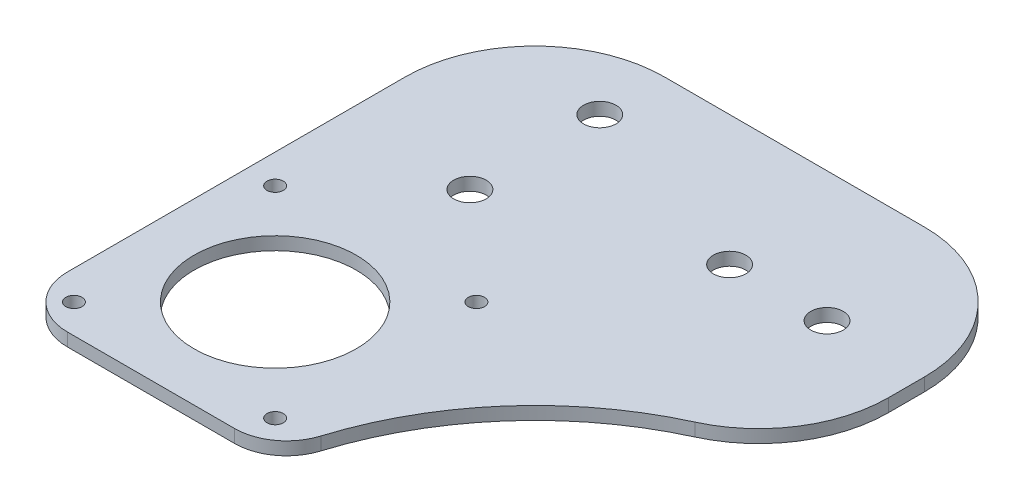
ISO-10303-21;
HEADER;
FILE_DESCRIPTION(('STEP AP214'),'2;1');
FILE_NAME('part.step','',(''),(''),'','','');
FILE_SCHEMA(('AUTOMOTIVE_DESIGN { 1 0 10303 214 1 1 1 1 }'));
ENDSEC;
DATA;
#1=APPLICATION_CONTEXT('core data for automotive mechanical design processes');
#2=APPLICATION_PROTOCOL_DEFINITION('international standard','automotive_design',2000,#1);
#3=PRODUCT_CONTEXT('',#1,'mechanical');
#4=PRODUCT('Part','Part','',(#3));
#5=PRODUCT_RELATED_PRODUCT_CATEGORY('part','',(#4));
#6=PRODUCT_DEFINITION_FORMATION('','',#4);
#7=PRODUCT_DEFINITION_CONTEXT('part definition',#1,'design');
#8=PRODUCT_DEFINITION('design','',#6,#7);
#9=PRODUCT_DEFINITION_SHAPE('','',#8);
#10=(LENGTH_UNIT() NAMED_UNIT(*) SI_UNIT(.MILLI.,.METRE.));
#11=(NAMED_UNIT(*) PLANE_ANGLE_UNIT() SI_UNIT($,.RADIAN.));
#12=(NAMED_UNIT(*) SI_UNIT($,.STERADIAN.) SOLID_ANGLE_UNIT());
#13=UNCERTAINTY_MEASURE_WITH_UNIT(LENGTH_MEASURE(1.E-05),#10,'distance_accuracy_value','');
#14=(GEOMETRIC_REPRESENTATION_CONTEXT(3) GLOBAL_UNCERTAINTY_ASSIGNED_CONTEXT((#13)) GLOBAL_UNIT_ASSIGNED_CONTEXT((#10,
#11,#12)) REPRESENTATION_CONTEXT('',''));
#15=CARTESIAN_POINT('',(0.,0.,0.));
#16=DIRECTION('',(0.,0.,1.));
#17=DIRECTION('',(1.,0.,0.));
#18=AXIS2_PLACEMENT_3D('',#15,#16,#17);
#19=CARTESIAN_POINT('',(0.,2.,-40.));
#20=DIRECTION('',(0.,0.,1.));
#21=DIRECTION('',(1.,0.,0.));
#22=AXIS2_PLACEMENT_3D('',#19,#20,#21);
#23=PLANE('',#22);
#24=DIRECTION('',(-1.,0.,0.));
#25=VECTOR('',#24,1.);
#26=CARTESIAN_POINT('',(0.,2.,-40.));
#27=LINE('',#26,#25);
#28=CARTESIAN_POINT('',(60.,2.,-40.));
#29=VERTEX_POINT('',#28);
#30=CARTESIAN_POINT('',(20.,2.,-40.));
#31=VERTEX_POINT('',#30);
#32=EDGE_CURVE('E134',#29,#31,#27,.T.);
#33=ORIENTED_EDGE('',*,*,#32,.F.);
#34=DIRECTION('',(0.,-1.,0.));
#35=VECTOR('',#34,1.);
#36=CARTESIAN_POINT('',(60.,0.,-40.));
#37=LINE('',#36,#35);
#38=CARTESIAN_POINT('',(60.,0.,-40.));
#39=VERTEX_POINT('',#38);
#40=EDGE_CURVE('E119',#29,#39,#37,.T.);
#41=ORIENTED_EDGE('',*,*,#40,.T.);
#42=DIRECTION('',(-1.,0.,0.));
#43=VECTOR('',#42,1.);
#44=CARTESIAN_POINT('',(0.,0.,-40.));
#45=LINE('',#44,#43);
#46=CARTESIAN_POINT('',(20.,0.,-40.));
#47=VERTEX_POINT('',#46);
#48=EDGE_CURVE('E131',#39,#47,#45,.T.);
#49=ORIENTED_EDGE('',*,*,#48,.T.);
#50=DIRECTION('',(0.,-1.,0.));
#51=VECTOR('',#50,1.);
#52=CARTESIAN_POINT('',(20.,2.,-40.));
#53=LINE('',#52,#51);
#54=EDGE_CURVE('E136',#47,#31,#53,.F.);
#55=ORIENTED_EDGE('',*,*,#54,.T.);
#56=EDGE_LOOP('',(#33,#41,#49,#55));
#57=FACE_BOUND('',#56,.T.);
#58=ADVANCED_FACE('F35',(#57),#23,.F.);
#59=CARTESIAN_POINT('',(0.,2.,0.));
#60=DIRECTION('',(1.,0.,0.));
#61=DIRECTION('',(0.,0.,-1.));
#62=AXIS2_PLACEMENT_3D('',#59,#60,#61);
#63=PLANE('',#62);
#64=DIRECTION('',(0.,0.,1.));
#65=VECTOR('',#64,1.);
#66=CARTESIAN_POINT('',(0.,0.,0.));
#67=LINE('',#66,#65);
#68=CARTESIAN_POINT('',(0.,0.,-20.));
#69=VERTEX_POINT('',#68);
#70=CARTESIAN_POINT('',(0.,0.,32.));
#71=VERTEX_POINT('',#70);
#72=EDGE_CURVE('E142',#69,#71,#67,.T.);
#73=ORIENTED_EDGE('',*,*,#72,.T.);
#74=DIRECTION('',(0.,-1.,0.));
#75=VECTOR('',#74,1.);
#76=CARTESIAN_POINT('',(0.,2.,32.));
#77=LINE('',#76,#75);
#78=CARTESIAN_POINT('',(0.,2.,32.));
#79=VERTEX_POINT('',#78);
#80=EDGE_CURVE('E58',#71,#79,#77,.F.);
#81=ORIENTED_EDGE('',*,*,#80,.T.);
#82=DIRECTION('',(0.,0.,1.));
#83=VECTOR('',#82,1.);
#84=CARTESIAN_POINT('',(0.,2.,0.));
#85=LINE('',#84,#83);
#86=CARTESIAN_POINT('',(0.,2.,-20.));
#87=VERTEX_POINT('',#86);
#88=EDGE_CURVE('E211',#87,#79,#85,.T.);
#89=ORIENTED_EDGE('',*,*,#88,.F.);
#90=DIRECTION('',(0.,-1.,0.));
#91=VECTOR('',#90,1.);
#92=CARTESIAN_POINT('',(0.,2.,-20.));
#93=LINE('',#92,#91);
#94=EDGE_CURVE('E193',#87,#69,#93,.T.);
#95=ORIENTED_EDGE('',*,*,#94,.T.);
#96=EDGE_LOOP('',(#73,#81,#89,#95));
#97=FACE_BOUND('',#96,.T.);
#98=ADVANCED_FACE('F220',(#97),#63,.F.);
#99=CARTESIAN_POINT('',(0.,2.,40.));
#100=DIRECTION('',(0.,0.,-1.));
#101=DIRECTION('',(-1.,0.,0.));
#102=AXIS2_PLACEMENT_3D('',#99,#100,#101);
#103=PLANE('',#102);
#104=DIRECTION('',(1.,0.,0.));
#105=VECTOR('',#104,1.);
#106=CARTESIAN_POINT('',(0.,2.,40.));
#107=LINE('',#106,#105);
#108=CARTESIAN_POINT('',(8.,2.,40.));
#109=VERTEX_POINT('',#108);
#110=CARTESIAN_POINT('',(33.7497576478441,2.,40.));
#111=VERTEX_POINT('',#110);
#112=EDGE_CURVE('E210',#109,#111,#107,.T.);
#113=ORIENTED_EDGE('',*,*,#112,.F.);
#114=DIRECTION('',(0.,-1.,0.));
#115=VECTOR('',#114,1.);
#116=CARTESIAN_POINT('',(8.,2.,40.));
#117=LINE('',#116,#115);
#118=CARTESIAN_POINT('',(8.,0.,40.));
#119=VERTEX_POINT('',#118);
#120=EDGE_CURVE('E198',#109,#119,#117,.T.);
#121=ORIENTED_EDGE('',*,*,#120,.T.);
#122=DIRECTION('',(1.,0.,0.));
#123=VECTOR('',#122,1.);
#124=CARTESIAN_POINT('',(0.,0.,40.));
#125=LINE('',#124,#123);
#126=CARTESIAN_POINT('',(33.7497576478441,0.,40.));
#127=VERTEX_POINT('',#126);
#128=EDGE_CURVE('E145',#119,#127,#125,.T.);
#129=ORIENTED_EDGE('',*,*,#128,.T.);
#130=DIRECTION('',(0.,1.,0.));
#131=VECTOR('',#130,1.);
#132=CARTESIAN_POINT('',(33.7497576478441,2.,40.));
#133=LINE('',#132,#131);
#134=EDGE_CURVE('E196',#127,#111,#133,.T.);
#135=ORIENTED_EDGE('',*,*,#134,.T.);
#136=EDGE_LOOP('',(#113,#121,#129,#135));
#137=FACE_BOUND('',#136,.T.);
#138=ADVANCED_FACE('F215',(#137),#103,.F.);
#139=CARTESIAN_POINT('',(35.5,2.,4.49999999999998));
#140=DIRECTION('',(0.,-1.,0.));
#141=DIRECTION('',(0.,0.,-1.));
#142=AXIS2_PLACEMENT_3D('',#139,#140,#141);
#143=CYLINDRICAL_SURFACE('',#142,1.25);
#144=CARTESIAN_POINT('',(35.5,2.,4.49999999999998));
#145=DIRECTION('',(0.,1.,0.));
#146=DIRECTION('',(0.,0.,1.));
#147=AXIS2_PLACEMENT_3D('',#144,#145,#146);
#148=CIRCLE('',#147,1.25);
#149=CARTESIAN_POINT('',(35.5,2.,5.74999999999998));
#150=VERTEX_POINT('',#149);
#151=EDGE_CURVE('E245',#150,#150,#148,.T.);
#152=ORIENTED_EDGE('',*,*,#151,.T.);
#153=EDGE_LOOP('',(#152));
#154=FACE_BOUND('',#153,.T.);
#155=CARTESIAN_POINT('',(35.5,0.,4.49999999999998));
#156=DIRECTION('',(0.,1.,0.));
#157=DIRECTION('',(0.,0.,1.));
#158=AXIS2_PLACEMENT_3D('',#155,#156,#157);
#159=CIRCLE('',#158,1.25);
#160=CARTESIAN_POINT('',(35.5,0.,5.74999999999998));
#161=VERTEX_POINT('',#160);
#162=EDGE_CURVE('E165',#161,#161,#159,.T.);
#163=ORIENTED_EDGE('',*,*,#162,.F.);
#164=EDGE_LOOP('',(#163));
#165=FACE_BOUND('',#164,.T.);
#166=ADVANCED_FACE('F288',(#154,#165),#143,.F.);
#167=CARTESIAN_POINT('',(35.5,2.,35.5));
#168=DIRECTION('',(0.,-1.,0.));
#169=DIRECTION('',(0.,0.,-1.));
#170=AXIS2_PLACEMENT_3D('',#167,#168,#169);
#171=CYLINDRICAL_SURFACE('',#170,1.25);
#172=CARTESIAN_POINT('',(35.5,2.,35.5));
#173=DIRECTION('',(0.,1.,0.));
#174=DIRECTION('',(0.,0.,1.));
#175=AXIS2_PLACEMENT_3D('',#172,#173,#174);
#176=CIRCLE('',#175,1.25);
#177=CARTESIAN_POINT('',(35.5,2.,36.75));
#178=VERTEX_POINT('',#177);
#179=EDGE_CURVE('E242',#178,#178,#176,.T.);
#180=ORIENTED_EDGE('',*,*,#179,.T.);
#181=EDGE_LOOP('',(#180));
#182=FACE_BOUND('',#181,.T.);
#183=CARTESIAN_POINT('',(35.5,0.,35.5));
#184=DIRECTION('',(0.,1.,0.));
#185=DIRECTION('',(0.,0.,1.));
#186=AXIS2_PLACEMENT_3D('',#183,#184,#185);
#187=CIRCLE('',#186,1.25);
#188=CARTESIAN_POINT('',(35.5,0.,36.75));
#189=VERTEX_POINT('',#188);
#190=EDGE_CURVE('E162',#189,#189,#187,.T.);
#191=ORIENTED_EDGE('',*,*,#190,.F.);
#192=EDGE_LOOP('',(#191));
#193=FACE_BOUND('',#192,.T.);
#194=ADVANCED_FACE('F298',(#182,#193),#171,.F.);
#195=CARTESIAN_POINT('',(4.50000000000001,2.,35.5));
#196=DIRECTION('',(0.,-1.,0.));
#197=DIRECTION('',(0.,0.,-1.));
#198=AXIS2_PLACEMENT_3D('',#195,#196,#197);
#199=CYLINDRICAL_SURFACE('',#198,1.25);
#200=CARTESIAN_POINT('',(4.50000000000001,2.,35.5));
#201=DIRECTION('',(0.,1.,0.));
#202=DIRECTION('',(0.,0.,1.));
#203=AXIS2_PLACEMENT_3D('',#200,#201,#202);
#204=CIRCLE('',#203,1.25);
#205=CARTESIAN_POINT('',(4.50000000000001,2.,36.75));
#206=VERTEX_POINT('',#205);
#207=EDGE_CURVE('E239',#206,#206,#204,.T.);
#208=ORIENTED_EDGE('',*,*,#207,.T.);
#209=EDGE_LOOP('',(#208));
#210=FACE_BOUND('',#209,.T.);
#211=CARTESIAN_POINT('',(4.50000000000001,0.,35.5));
#212=DIRECTION('',(0.,1.,0.));
#213=DIRECTION('',(0.,0.,1.));
#214=AXIS2_PLACEMENT_3D('',#211,#212,#213);
#215=CIRCLE('',#214,1.25);
#216=CARTESIAN_POINT('',(4.50000000000001,0.,36.75));
#217=VERTEX_POINT('',#216);
#218=EDGE_CURVE('E159',#217,#217,#215,.T.);
#219=ORIENTED_EDGE('',*,*,#218,.F.);
#220=EDGE_LOOP('',(#219));
#221=FACE_BOUND('',#220,.T.);
#222=ADVANCED_FACE('F294',(#210,#221),#199,.F.);
#223=CARTESIAN_POINT('',(20.,2.,20.));
#224=DIRECTION('',(0.,-1.,0.));
#225=DIRECTION('',(0.,0.,-1.));
#226=AXIS2_PLACEMENT_3D('',#223,#224,#225);
#227=CYLINDRICAL_SURFACE('',#226,12.5);
#228=CARTESIAN_POINT('',(20.,2.,20.));
#229=DIRECTION('',(0.,1.,0.));
#230=DIRECTION('',(0.,0.,1.));
#231=AXIS2_PLACEMENT_3D('',#228,#229,#230);
#232=CIRCLE('',#231,12.5);
#233=CARTESIAN_POINT('',(20.,2.,32.5));
#234=VERTEX_POINT('',#233);
#235=EDGE_CURVE('E236',#234,#234,#232,.T.);
#236=ORIENTED_EDGE('',*,*,#235,.T.);
#237=EDGE_LOOP('',(#236));
#238=FACE_BOUND('',#237,.T.);
#239=CARTESIAN_POINT('',(20.,0.,20.));
#240=DIRECTION('',(0.,1.,0.));
#241=DIRECTION('',(0.,0.,1.));
#242=AXIS2_PLACEMENT_3D('',#239,#240,#241);
#243=CIRCLE('',#242,12.5);
#244=CARTESIAN_POINT('',(20.,0.,32.5));
#245=VERTEX_POINT('',#244);
#246=EDGE_CURVE('E156',#245,#245,#243,.T.);
#247=ORIENTED_EDGE('',*,*,#246,.F.);
#248=EDGE_LOOP('',(#247));
#249=FACE_BOUND('',#248,.T.);
#250=ADVANCED_FACE('F290',(#238,#249),#227,.F.);
#251=CARTESIAN_POINT('',(80.,2.,0.));
#252=DIRECTION('',(1.,0.,0.));
#253=DIRECTION('',(0.,0.,-1.));
#254=AXIS2_PLACEMENT_3D('',#251,#252,#253);
#255=PLANE('',#254);
#256=DIRECTION('',(0.,0.,1.));
#257=VECTOR('',#256,1.);
#258=CARTESIAN_POINT('',(80.,0.,0.));
#259=LINE('',#258,#257);
#260=CARTESIAN_POINT('',(80.,0.,-20.));
#261=VERTEX_POINT('',#260);
#262=CARTESIAN_POINT('',(80.,0.,-14.4848508325628));
#263=VERTEX_POINT('',#262);
#264=EDGE_CURVE('E154',#261,#263,#259,.T.);
#265=ORIENTED_EDGE('',*,*,#264,.F.);
#266=DIRECTION('',(0.,-1.,0.));
#267=VECTOR('',#266,1.);
#268=CARTESIAN_POINT('',(80.,2.,-20.));
#269=LINE('',#268,#267);
#270=CARTESIAN_POINT('',(80.,2.,-20.));
#271=VERTEX_POINT('',#270);
#272=EDGE_CURVE('E120',#261,#271,#269,.F.);
#273=ORIENTED_EDGE('',*,*,#272,.T.);
#274=DIRECTION('',(0.,0.,1.));
#275=VECTOR('',#274,1.);
#276=CARTESIAN_POINT('',(80.,2.,0.));
#277=LINE('',#276,#275);
#278=CARTESIAN_POINT('',(80.,2.,-14.4848508325628));
#279=VERTEX_POINT('',#278);
#280=EDGE_CURVE('E217',#271,#279,#277,.T.);
#281=ORIENTED_EDGE('',*,*,#280,.T.);
#282=DIRECTION('',(0.,-1.,0.));
#283=VECTOR('',#282,1.);
#284=CARTESIAN_POINT('',(80.,0.,-14.4848508325628));
#285=LINE('',#284,#283);
#286=EDGE_CURVE('E125',#279,#263,#285,.T.);
#287=ORIENTED_EDGE('',*,*,#286,.T.);
#288=EDGE_LOOP('',(#265,#273,#281,#287));
#289=FACE_BOUND('',#288,.T.);
#290=ADVANCED_FACE('F273',(#289),#255,.T.);
#291=CARTESIAN_POINT('',(20.,2.,-10.));
#292=DIRECTION('',(0.,-1.,0.));
#293=DIRECTION('',(0.,0.,-1.));
#294=AXIS2_PLACEMENT_3D('',#291,#292,#293);
#295=CYLINDRICAL_SURFACE('',#294,2.5);
#296=CARTESIAN_POINT('',(20.,2.,-10.));
#297=DIRECTION('',(0.,1.,0.));
#298=DIRECTION('',(0.,0.,1.));
#299=AXIS2_PLACEMENT_3D('',#296,#297,#298);
#300=CIRCLE('',#299,2.5);
#301=CARTESIAN_POINT('',(20.,2.,-7.5));
#302=VERTEX_POINT('',#301);
#303=EDGE_CURVE('E226',#302,#302,#300,.T.);
#304=ORIENTED_EDGE('',*,*,#303,.T.);
#305=EDGE_LOOP('',(#304));
#306=FACE_BOUND('',#305,.T.);
#307=CARTESIAN_POINT('',(20.,0.,-10.));
#308=DIRECTION('',(0.,1.,0.));
#309=DIRECTION('',(0.,0.,1.));
#310=AXIS2_PLACEMENT_3D('',#307,#308,#309);
#311=CIRCLE('',#310,2.5);
#312=CARTESIAN_POINT('',(20.,0.,-7.5));
#313=VERTEX_POINT('',#312);
#314=EDGE_CURVE('E143',#313,#313,#311,.T.);
#315=ORIENTED_EDGE('',*,*,#314,.F.);
#316=EDGE_LOOP('',(#315));
#317=FACE_BOUND('',#316,.T.);
#318=ADVANCED_FACE('F263',(#306,#317),#295,.F.);
#319=CARTESIAN_POINT('',(65.,2.,-20.));
#320=DIRECTION('',(0.,-1.,0.));
#321=DIRECTION('',(0.,0.,-1.));
#322=AXIS2_PLACEMENT_3D('',#319,#320,#321);
#323=CYLINDRICAL_SURFACE('',#322,2.5);
#324=CARTESIAN_POINT('',(65.,2.,-20.));
#325=DIRECTION('',(0.,1.,0.));
#326=DIRECTION('',(0.,0.,1.));
#327=AXIS2_PLACEMENT_3D('',#324,#325,#326);
#328=CIRCLE('',#327,2.5);
#329=CARTESIAN_POINT('',(65.,2.,-17.5));
#330=VERTEX_POINT('',#329);
#331=EDGE_CURVE('E230',#330,#330,#328,.T.);
#332=ORIENTED_EDGE('',*,*,#331,.T.);
#333=EDGE_LOOP('',(#332));
#334=FACE_BOUND('',#333,.T.);
#335=CARTESIAN_POINT('',(65.,0.,-20.));
#336=DIRECTION('',(0.,1.,0.));
#337=DIRECTION('',(0.,0.,1.));
#338=AXIS2_PLACEMENT_3D('',#335,#336,#337);
#339=CIRCLE('',#338,2.5);
#340=CARTESIAN_POINT('',(65.,0.,-17.5));
#341=VERTEX_POINT('',#340);
#342=EDGE_CURVE('E148',#341,#341,#339,.T.);
#343=ORIENTED_EDGE('',*,*,#342,.F.);
#344=EDGE_LOOP('',(#343));
#345=FACE_BOUND('',#344,.T.);
#346=ADVANCED_FACE('F260',(#334,#345),#323,.F.);
#347=CARTESIAN_POINT('',(50.,2.,-20.));
#348=DIRECTION('',(0.,-1.,0.));
#349=DIRECTION('',(0.,0.,-1.));
#350=AXIS2_PLACEMENT_3D('',#347,#348,#349);
#351=CYLINDRICAL_SURFACE('',#350,2.5);
#352=CARTESIAN_POINT('',(50.,2.,-20.));
#353=DIRECTION('',(0.,1.,0.));
#354=DIRECTION('',(0.,0.,1.));
#355=AXIS2_PLACEMENT_3D('',#352,#353,#354);
#356=CIRCLE('',#355,2.5);
#357=CARTESIAN_POINT('',(50.,2.,-17.5));
#358=VERTEX_POINT('',#357);
#359=EDGE_CURVE('E324',#358,#358,#356,.T.);
#360=ORIENTED_EDGE('',*,*,#359,.T.);
#361=EDGE_LOOP('',(#360));
#362=FACE_BOUND('',#361,.T.);
#363=CARTESIAN_POINT('',(50.,0.,-20.));
#364=DIRECTION('',(0.,1.,0.));
#365=DIRECTION('',(0.,0.,1.));
#366=AXIS2_PLACEMENT_3D('',#363,#364,#365);
#367=CIRCLE('',#366,2.5);
#368=CARTESIAN_POINT('',(50.,0.,-17.5));
#369=VERTEX_POINT('',#368);
#370=EDGE_CURVE('E253',#369,#369,#367,.T.);
#371=ORIENTED_EDGE('',*,*,#370,.F.);
#372=EDGE_LOOP('',(#371));
#373=FACE_BOUND('',#372,.T.);
#374=ADVANCED_FACE('F262',(#362,#373),#351,.F.);
#375=CARTESIAN_POINT('',(20.,2.,-30.));
#376=DIRECTION('',(0.,-1.,0.));
#377=DIRECTION('',(0.,0.,-1.));
#378=AXIS2_PLACEMENT_3D('',#375,#376,#377);
#379=CYLINDRICAL_SURFACE('',#378,2.5);
#380=CARTESIAN_POINT('',(20.,2.,-30.));
#381=DIRECTION('',(0.,1.,0.));
#382=DIRECTION('',(0.,0.,1.));
#383=AXIS2_PLACEMENT_3D('',#380,#381,#382);
#384=CIRCLE('',#383,2.5);
#385=CARTESIAN_POINT('',(20.,2.,-27.5));
#386=VERTEX_POINT('',#385);
#387=EDGE_CURVE('E171',#386,#386,#384,.T.);
#388=ORIENTED_EDGE('',*,*,#387,.T.);
#389=EDGE_LOOP('',(#388));
#390=FACE_BOUND('',#389,.T.);
#391=CARTESIAN_POINT('',(20.,0.,-30.));
#392=DIRECTION('',(0.,1.,0.));
#393=DIRECTION('',(0.,0.,1.));
#394=AXIS2_PLACEMENT_3D('',#391,#392,#393);
#395=CIRCLE('',#394,2.5);
#396=CARTESIAN_POINT('',(20.,0.,-27.5));
#397=VERTEX_POINT('',#396);
#398=EDGE_CURVE('E250',#397,#397,#395,.T.);
#399=ORIENTED_EDGE('',*,*,#398,.F.);
#400=EDGE_LOOP('',(#399));
#401=FACE_BOUND('',#400,.T.);
#402=ADVANCED_FACE('F270',(#390,#401),#379,.F.);
#403=CARTESIAN_POINT('',(4.50000000000001,2.,4.49999999999999));
#404=DIRECTION('',(0.,-1.,0.));
#405=DIRECTION('',(0.,0.,-1.));
#406=AXIS2_PLACEMENT_3D('',#403,#404,#405);
#407=CYLINDRICAL_SURFACE('',#406,1.25);
#408=CARTESIAN_POINT('',(4.50000000000001,2.,4.49999999999999));
#409=DIRECTION('',(0.,1.,0.));
#410=DIRECTION('',(0.,0.,1.));
#411=AXIS2_PLACEMENT_3D('',#408,#409,#410);
#412=CIRCLE('',#411,1.25);
#413=CARTESIAN_POINT('',(4.50000000000001,2.,5.74999999999999));
#414=VERTEX_POINT('',#413);
#415=EDGE_CURVE('E176',#414,#414,#412,.T.);
#416=ORIENTED_EDGE('',*,*,#415,.T.);
#417=EDGE_LOOP('',(#416));
#418=FACE_BOUND('',#417,.T.);
#419=CARTESIAN_POINT('',(4.50000000000001,0.,4.49999999999999));
#420=DIRECTION('',(0.,1.,0.));
#421=DIRECTION('',(0.,0.,1.));
#422=AXIS2_PLACEMENT_3D('',#419,#420,#421);
#423=CIRCLE('',#422,1.25);
#424=CARTESIAN_POINT('',(4.50000000000001,0.,5.74999999999999));
#425=VERTEX_POINT('',#424);
#426=EDGE_CURVE('E168',#425,#425,#423,.T.);
#427=ORIENTED_EDGE('',*,*,#426,.F.);
#428=EDGE_LOOP('',(#427));
#429=FACE_BOUND('',#428,.T.);
#430=ADVANCED_FACE('F306',(#418,#429),#407,.F.);
#431=CARTESIAN_POINT('',(0.,2.,0.));
#432=DIRECTION('',(0.,1.,0.));
#433=DIRECTION('',(0.,0.,1.));
#434=AXIS2_PLACEMENT_3D('',#431,#432,#433);
#435=PLANE('',#434);
#436=ORIENTED_EDGE('',*,*,#387,.F.);
#437=EDGE_LOOP('',(#436));
#438=FACE_BOUND('',#437,.T.);
#439=ORIENTED_EDGE('',*,*,#359,.F.);
#440=EDGE_LOOP('',(#439));
#441=FACE_BOUND('',#440,.T.);
#442=ORIENTED_EDGE('',*,*,#331,.F.);
#443=EDGE_LOOP('',(#442));
#444=FACE_BOUND('',#443,.T.);
#445=ORIENTED_EDGE('',*,*,#303,.F.);
#446=EDGE_LOOP('',(#445));
#447=FACE_BOUND('',#446,.T.);
#448=ORIENTED_EDGE('',*,*,#88,.T.);
#449=CARTESIAN_POINT('',(8.,2.,32.));
#450=DIRECTION('',(0.,1.,0.));
#451=DIRECTION('',(0.,0.,1.));
#452=AXIS2_PLACEMENT_3D('',#449,#450,#451);
#453=CIRCLE('',#452,8.);
#454=EDGE_CURVE('E43',#79,#109,#453,.T.);
#455=ORIENTED_EDGE('',*,*,#454,.T.);
#456=ORIENTED_EDGE('',*,*,#112,.T.);
#457=CARTESIAN_POINT('',(33.7497576478441,2.,32.));
#458=DIRECTION('',(0.,1.,0.));
#459=DIRECTION('',(0.,0.,1.));
#460=AXIS2_PLACEMENT_3D('',#457,#458,#459);
#461=CIRCLE('',#460,8.);
#462=CARTESIAN_POINT('',(41.3918268652762,2.,34.366173720583));
#463=VERTEX_POINT('',#462);
#464=EDGE_CURVE('E50',#111,#463,#461,.T.);
#465=ORIENTED_EDGE('',*,*,#464,.T.);
#466=CARTESIAN_POINT('',(89.1547594742265,2.,49.1547594742265));
#467=DIRECTION('',(0.,1.,0.));
#468=DIRECTION('',(0.,0.,1.));
#469=AXIS2_PLACEMENT_3D('',#466,#467,#468);
#470=CIRCLE('',#469,50.);
#471=CARTESIAN_POINT('',(68.3299312783504,2.,3.69789496937702));
#472=VERTEX_POINT('',#471);
#473=EDGE_CURVE('E175',#463,#472,#470,.F.);
#474=ORIENTED_EDGE('',*,*,#473,.T.);
#475=CARTESIAN_POINT('',(60.,2.,-14.4848508325628));
#476=DIRECTION('',(0.,1.,0.));
#477=DIRECTION('',(0.,0.,1.));
#478=AXIS2_PLACEMENT_3D('',#475,#476,#477);
#479=CIRCLE('',#478,20.);
#480=EDGE_CURVE('E186',#472,#279,#479,.T.);
#481=ORIENTED_EDGE('',*,*,#480,.T.);
#482=ORIENTED_EDGE('',*,*,#280,.F.);
#483=CARTESIAN_POINT('',(60.,2.,-20.));
#484=DIRECTION('',(0.,1.,0.));
#485=DIRECTION('',(0.,0.,1.));
#486=AXIS2_PLACEMENT_3D('',#483,#484,#485);
#487=CIRCLE('',#486,20.);
#488=EDGE_CURVE('E188',#271,#29,#487,.T.);
#489=ORIENTED_EDGE('',*,*,#488,.T.);
#490=ORIENTED_EDGE('',*,*,#32,.T.);
#491=CARTESIAN_POINT('',(20.,2.,-20.));
#492=DIRECTION('',(0.,1.,0.));
#493=DIRECTION('',(0.,0.,1.));
#494=AXIS2_PLACEMENT_3D('',#491,#492,#493);
#495=CIRCLE('',#494,20.);
#496=EDGE_CURVE('E184',#31,#87,#495,.T.);
#497=ORIENTED_EDGE('',*,*,#496,.T.);
#498=EDGE_LOOP('',(#448,#455,#456,#465,#474,#481,#482,#489,#490,#497));
#499=FACE_BOUND('',#498,.T.);
#500=ORIENTED_EDGE('',*,*,#235,.F.);
#501=EDGE_LOOP('',(#500));
#502=FACE_BOUND('',#501,.T.);
#503=ORIENTED_EDGE('',*,*,#207,.F.);
#504=EDGE_LOOP('',(#503));
#505=FACE_BOUND('',#504,.T.);
#506=ORIENTED_EDGE('',*,*,#179,.F.);
#507=EDGE_LOOP('',(#506));
#508=FACE_BOUND('',#507,.T.);
#509=ORIENTED_EDGE('',*,*,#151,.F.);
#510=EDGE_LOOP('',(#509));
#511=FACE_BOUND('',#510,.T.);
#512=ORIENTED_EDGE('',*,*,#415,.F.);
#513=EDGE_LOOP('',(#512));
#514=FACE_BOUND('',#513,.T.);
#515=ADVANCED_FACE('F208',(#438,#441,#444,#447,#499,#502,#505,#508,#511,#514),#435,.T.);
#516=CARTESIAN_POINT('',(0.,0.,0.));
#517=DIRECTION('',(0.,1.,0.));
#518=DIRECTION('',(0.,0.,1.));
#519=AXIS2_PLACEMENT_3D('',#516,#517,#518);
#520=PLANE('',#519);
#521=ORIENTED_EDGE('',*,*,#398,.T.);
#522=EDGE_LOOP('',(#521));
#523=FACE_BOUND('',#522,.T.);
#524=ORIENTED_EDGE('',*,*,#370,.T.);
#525=EDGE_LOOP('',(#524));
#526=FACE_BOUND('',#525,.T.);
#527=ORIENTED_EDGE('',*,*,#342,.T.);
#528=EDGE_LOOP('',(#527));
#529=FACE_BOUND('',#528,.T.);
#530=ORIENTED_EDGE('',*,*,#314,.T.);
#531=EDGE_LOOP('',(#530));
#532=FACE_BOUND('',#531,.T.);
#533=ORIENTED_EDGE('',*,*,#128,.F.);
#534=CARTESIAN_POINT('',(8.,0.,32.));
#535=DIRECTION('',(0.,1.,0.));
#536=DIRECTION('',(0.,0.,1.));
#537=AXIS2_PLACEMENT_3D('',#534,#535,#536);
#538=CIRCLE('',#537,8.);
#539=EDGE_CURVE('E203',#119,#71,#538,.F.);
#540=ORIENTED_EDGE('',*,*,#539,.T.);
#541=ORIENTED_EDGE('',*,*,#72,.F.);
#542=CARTESIAN_POINT('',(20.,0.,-20.));
#543=DIRECTION('',(0.,1.,0.));
#544=DIRECTION('',(0.,0.,1.));
#545=AXIS2_PLACEMENT_3D('',#542,#543,#544);
#546=CIRCLE('',#545,20.);
#547=EDGE_CURVE('E135',#69,#47,#546,.F.);
#548=ORIENTED_EDGE('',*,*,#547,.T.);
#549=ORIENTED_EDGE('',*,*,#48,.F.);
#550=CARTESIAN_POINT('',(60.,0.,-20.));
#551=DIRECTION('',(0.,1.,0.));
#552=DIRECTION('',(0.,0.,1.));
#553=AXIS2_PLACEMENT_3D('',#550,#551,#552);
#554=CIRCLE('',#553,20.);
#555=EDGE_CURVE('E115',#39,#261,#554,.F.);
#556=ORIENTED_EDGE('',*,*,#555,.T.);
#557=ORIENTED_EDGE('',*,*,#264,.T.);
#558=CARTESIAN_POINT('',(60.,0.,-14.4848508325628));
#559=DIRECTION('',(0.,1.,0.));
#560=DIRECTION('',(0.,0.,1.));
#561=AXIS2_PLACEMENT_3D('',#558,#559,#560);
#562=CIRCLE('',#561,20.);
#563=CARTESIAN_POINT('',(68.3299312783504,0.,3.69789496937702));
#564=VERTEX_POINT('',#563);
#565=EDGE_CURVE('E126',#263,#564,#562,.F.);
#566=ORIENTED_EDGE('',*,*,#565,.T.);
#567=CARTESIAN_POINT('',(89.1547594742265,0.,49.1547594742265));
#568=DIRECTION('',(0.,1.,0.));
#569=DIRECTION('',(0.,0.,1.));
#570=AXIS2_PLACEMENT_3D('',#567,#568,#569);
#571=CIRCLE('',#570,50.);
#572=CARTESIAN_POINT('',(41.3918268652762,0.,34.366173720583));
#573=VERTEX_POINT('',#572);
#574=EDGE_CURVE('E172',#564,#573,#571,.T.);
#575=ORIENTED_EDGE('',*,*,#574,.T.);
#576=CARTESIAN_POINT('',(33.7497576478441,0.,32.));
#577=DIRECTION('',(0.,1.,0.));
#578=DIRECTION('',(0.,0.,1.));
#579=AXIS2_PLACEMENT_3D('',#576,#577,#578);
#580=CIRCLE('',#579,8.);
#581=EDGE_CURVE('E201',#573,#127,#580,.F.);
#582=ORIENTED_EDGE('',*,*,#581,.T.);
#583=EDGE_LOOP('',(#533,#540,#541,#548,#549,#556,#557,#566,#575,#582));
#584=FACE_BOUND('',#583,.T.);
#585=ORIENTED_EDGE('',*,*,#246,.T.);
#586=EDGE_LOOP('',(#585));
#587=FACE_BOUND('',#586,.T.);
#588=ORIENTED_EDGE('',*,*,#218,.T.);
#589=EDGE_LOOP('',(#588));
#590=FACE_BOUND('',#589,.T.);
#591=ORIENTED_EDGE('',*,*,#190,.T.);
#592=EDGE_LOOP('',(#591));
#593=FACE_BOUND('',#592,.T.);
#594=ORIENTED_EDGE('',*,*,#162,.T.);
#595=EDGE_LOOP('',(#594));
#596=FACE_BOUND('',#595,.T.);
#597=ORIENTED_EDGE('',*,*,#426,.T.);
#598=EDGE_LOOP('',(#597));
#599=FACE_BOUND('',#598,.T.);
#600=ADVANCED_FACE('F139',(#523,#526,#529,#532,#584,#587,#590,#593,#596,#599),#520,.F.);
#601=CARTESIAN_POINT('',(89.1547594742265,2.,49.1547594742265));
#602=DIRECTION('',(0.,1.,0.));
#603=DIRECTION('',(0.,0.,1.));
#604=AXIS2_PLACEMENT_3D('',#601,#602,#603);
#605=CYLINDRICAL_SURFACE('',#604,50.);
#606=ORIENTED_EDGE('',*,*,#473,.F.);
#607=DIRECTION('',(0.,1.,0.));
#608=VECTOR('',#607,1.);
#609=CARTESIAN_POINT('',(41.3918268652762,2.,34.366173720583));
#610=LINE('',#609,#608);
#611=EDGE_CURVE('E11',#463,#573,#610,.F.);
#612=ORIENTED_EDGE('',*,*,#611,.T.);
#613=ORIENTED_EDGE('',*,*,#574,.F.);
#614=DIRECTION('',(0.,1.,0.));
#615=VECTOR('',#614,1.);
#616=CARTESIAN_POINT('',(68.3299312783504,2.,3.69789496937702));
#617=LINE('',#616,#615);
#618=EDGE_CURVE('E190',#564,#472,#617,.T.);
#619=ORIENTED_EDGE('',*,*,#618,.T.);
#620=EDGE_LOOP('',(#606,#612,#613,#619));
#621=FACE_BOUND('',#620,.T.);
#622=ADVANCED_FACE('F312',(#621),#605,.F.);
#623=CARTESIAN_POINT('',(60.,2.,-20.));
#624=DIRECTION('',(0.,1.,0.));
#625=DIRECTION('',(0.,0.,1.));
#626=AXIS2_PLACEMENT_3D('',#623,#624,#625);
#627=CYLINDRICAL_SURFACE('',#626,20.);
#628=ORIENTED_EDGE('',*,*,#488,.F.);
#629=ORIENTED_EDGE('',*,*,#272,.F.);
#630=ORIENTED_EDGE('',*,*,#555,.F.);
#631=ORIENTED_EDGE('',*,*,#40,.F.);
#632=EDGE_LOOP('',(#628,#629,#630,#631));
#633=FACE_BOUND('',#632,.T.);
#634=ADVANCED_FACE('F118',(#633),#627,.T.);
#635=CARTESIAN_POINT('',(60.,2.,-14.4848508325628));
#636=DIRECTION('',(0.,1.,0.));
#637=DIRECTION('',(0.,0.,1.));
#638=AXIS2_PLACEMENT_3D('',#635,#636,#637);
#639=CYLINDRICAL_SURFACE('',#638,20.);
#640=ORIENTED_EDGE('',*,*,#480,.F.);
#641=ORIENTED_EDGE('',*,*,#618,.F.);
#642=ORIENTED_EDGE('',*,*,#565,.F.);
#643=ORIENTED_EDGE('',*,*,#286,.F.);
#644=EDGE_LOOP('',(#640,#641,#642,#643));
#645=FACE_BOUND('',#644,.T.);
#646=ADVANCED_FACE('F348',(#645),#639,.T.);
#647=CARTESIAN_POINT('',(20.,2.,-20.));
#648=DIRECTION('',(0.,-1.,0.));
#649=DIRECTION('',(0.,0.,-1.));
#650=AXIS2_PLACEMENT_3D('',#647,#648,#649);
#651=CYLINDRICAL_SURFACE('',#650,20.);
#652=ORIENTED_EDGE('',*,*,#496,.F.);
#653=ORIENTED_EDGE('',*,*,#54,.F.);
#654=ORIENTED_EDGE('',*,*,#547,.F.);
#655=ORIENTED_EDGE('',*,*,#94,.F.);
#656=EDGE_LOOP('',(#652,#653,#654,#655));
#657=FACE_BOUND('',#656,.T.);
#658=ADVANCED_FACE('F224',(#657),#651,.T.);
#659=CARTESIAN_POINT('',(8.,2.,32.));
#660=DIRECTION('',(0.,-1.,0.));
#661=DIRECTION('',(0.,0.,-1.));
#662=AXIS2_PLACEMENT_3D('',#659,#660,#661);
#663=CYLINDRICAL_SURFACE('',#662,8.);
#664=ORIENTED_EDGE('',*,*,#454,.F.);
#665=ORIENTED_EDGE('',*,*,#80,.F.);
#666=ORIENTED_EDGE('',*,*,#539,.F.);
#667=ORIENTED_EDGE('',*,*,#120,.F.);
#668=EDGE_LOOP('',(#664,#665,#666,#667));
#669=FACE_BOUND('',#668,.T.);
#670=ADVANCED_FACE('F219',(#669),#663,.T.);
#671=CARTESIAN_POINT('',(33.7497576478441,2.,32.));
#672=DIRECTION('',(0.,1.,0.));
#673=DIRECTION('',(0.,0.,1.));
#674=AXIS2_PLACEMENT_3D('',#671,#672,#673);
#675=CYLINDRICAL_SURFACE('',#674,8.);
#676=ORIENTED_EDGE('',*,*,#464,.F.);
#677=ORIENTED_EDGE('',*,*,#134,.F.);
#678=ORIENTED_EDGE('',*,*,#581,.F.);
#679=ORIENTED_EDGE('',*,*,#611,.F.);
#680=EDGE_LOOP('',(#676,#677,#678,#679));
#681=FACE_BOUND('',#680,.T.);
#682=ADVANCED_FACE('F37',(#681),#675,.T.);
#683=CLOSED_SHELL('',(#58,#98,#138,#166,#194,#222,#250,#290,#318,#346,#374,#402,#430,#515,#600,
#622,#634,#646,#658,#670,#682));
#684=MANIFOLD_SOLID_BREP('B2',#683);
#685=ADVANCED_BREP_SHAPE_REPRESENTATION('',(#18,#684),#14);
#686=SHAPE_DEFINITION_REPRESENTATION(#9,#685);
ENDSEC;
END-ISO-10303-21;
